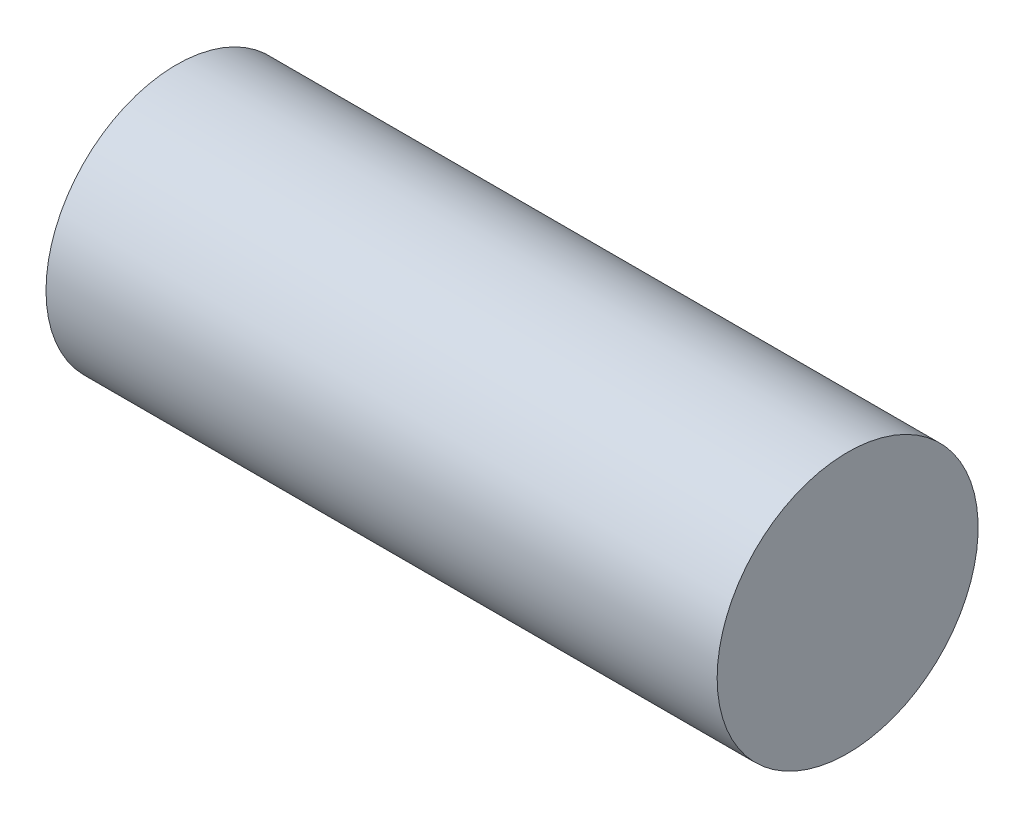
ISO-10303-21;
HEADER;
FILE_DESCRIPTION(('STEP AP214'),'2;1');
FILE_NAME('part.step','',(''),(''),'','','');
FILE_SCHEMA(('AUTOMOTIVE_DESIGN { 1 0 10303 214 1 1 1 1 }'));
ENDSEC;
DATA;
#1=APPLICATION_CONTEXT('core data for automotive mechanical design processes');
#2=APPLICATION_PROTOCOL_DEFINITION('international standard','automotive_design',2000,#1);
#3=PRODUCT_CONTEXT('',#1,'mechanical');
#4=PRODUCT('Part','Part','',(#3));
#5=PRODUCT_RELATED_PRODUCT_CATEGORY('part','',(#4));
#6=PRODUCT_DEFINITION_FORMATION('','',#4);
#7=PRODUCT_DEFINITION_CONTEXT('part definition',#1,'design');
#8=PRODUCT_DEFINITION('design','',#6,#7);
#9=PRODUCT_DEFINITION_SHAPE('','',#8);
#10=(LENGTH_UNIT() NAMED_UNIT(*) SI_UNIT(.MILLI.,.METRE.));
#11=(NAMED_UNIT(*) PLANE_ANGLE_UNIT() SI_UNIT($,.RADIAN.));
#12=(NAMED_UNIT(*) SI_UNIT($,.STERADIAN.) SOLID_ANGLE_UNIT());
#13=UNCERTAINTY_MEASURE_WITH_UNIT(LENGTH_MEASURE(1.E-05),#10,'distance_accuracy_value','');
#14=(GEOMETRIC_REPRESENTATION_CONTEXT(3) GLOBAL_UNCERTAINTY_ASSIGNED_CONTEXT((#13)) GLOBAL_UNIT_ASSIGNED_CONTEXT((#10,
#11,#12)) REPRESENTATION_CONTEXT('',''));
#15=CARTESIAN_POINT('',(0.,0.,0.));
#16=DIRECTION('',(0.,0.,1.));
#17=DIRECTION('',(1.,0.,0.));
#18=AXIS2_PLACEMENT_3D('',#15,#16,#17);
#19=CARTESIAN_POINT('',(90.,0.,0.));
#20=DIRECTION('',(-1.,0.,0.));
#21=DIRECTION('',(0.,0.,1.));
#22=AXIS2_PLACEMENT_3D('',#19,#20,#21);
#23=CYLINDRICAL_SURFACE('',#22,35.);
#24=CARTESIAN_POINT('',(90.,0.,0.));
#25=DIRECTION('',(1.,0.,0.));
#26=DIRECTION('',(0.,0.,-1.));
#27=AXIS2_PLACEMENT_3D('',#24,#25,#26);
#28=CIRCLE('',#27,35.);
#29=CARTESIAN_POINT('',(90.,0.,35.));
#30=VERTEX_POINT('',#29);
#31=EDGE_CURVE('E10',#30,#30,#28,.T.);
#32=CARTESIAN_POINT('',(-90.,0.,0.));
#33=DIRECTION('',(1.,0.,0.));
#34=DIRECTION('',(0.,0.,-1.));
#35=AXIS2_PLACEMENT_3D('',#32,#33,#34);
#36=CIRCLE('',#35,35.);
#37=CARTESIAN_POINT('',(-90.,0.,35.));
#38=VERTEX_POINT('',#37);
#39=EDGE_CURVE('E45',#38,#38,#36,.T.);
#40=CARTESIAN_POINT('',(90.,0.,35.));
#41=CARTESIAN_POINT('',(88.125,0.,35.));
#42=CARTESIAN_POINT('',(86.25,0.,35.));
#43=CARTESIAN_POINT('',(82.5,0.,35.));
#44=CARTESIAN_POINT('',(80.625,0.,35.));
#45=CARTESIAN_POINT('',(76.875,0.,35.));
#46=CARTESIAN_POINT('',(75.,0.,35.));
#47=CARTESIAN_POINT('',(71.25,0.,35.));
#48=CARTESIAN_POINT('',(69.375,0.,35.));
#49=CARTESIAN_POINT('',(65.625,0.,35.));
#50=CARTESIAN_POINT('',(63.75,0.,35.));
#51=CARTESIAN_POINT('',(60.,0.,35.));
#52=CARTESIAN_POINT('',(58.125,0.,35.));
#53=CARTESIAN_POINT('',(54.375,0.,35.));
#54=CARTESIAN_POINT('',(52.5,0.,35.));
#55=CARTESIAN_POINT('',(48.75,0.,35.));
#56=CARTESIAN_POINT('',(46.875,0.,35.));
#57=CARTESIAN_POINT('',(43.125,0.,35.));
#58=CARTESIAN_POINT('',(41.25,0.,35.));
#59=CARTESIAN_POINT('',(37.5,0.,35.));
#60=CARTESIAN_POINT('',(35.625,0.,35.));
#61=CARTESIAN_POINT('',(31.875,0.,35.));
#62=CARTESIAN_POINT('',(30.,0.,35.));
#63=CARTESIAN_POINT('',(26.25,0.,35.));
#64=CARTESIAN_POINT('',(24.375,0.,35.));
#65=CARTESIAN_POINT('',(20.625,0.,35.));
#66=CARTESIAN_POINT('',(18.75,0.,35.));
#67=CARTESIAN_POINT('',(15.,0.,35.));
#68=CARTESIAN_POINT('',(13.125,0.,35.));
#69=CARTESIAN_POINT('',(9.37499999999999,0.,35.));
#70=CARTESIAN_POINT('',(7.49999999999999,0.,35.));
#71=CARTESIAN_POINT('',(3.74999999999999,0.,35.));
#72=CARTESIAN_POINT('',(1.87499999999999,0.,35.));
#73=CARTESIAN_POINT('',(-1.87500000000002,0.,35.));
#74=CARTESIAN_POINT('',(-3.75000000000002,0.,35.));
#75=CARTESIAN_POINT('',(-7.50000000000002,0.,35.));
#76=CARTESIAN_POINT('',(-9.37500000000002,0.,35.));
#77=CARTESIAN_POINT('',(-13.125,0.,35.));
#78=CARTESIAN_POINT('',(-15.,0.,35.));
#79=CARTESIAN_POINT('',(-18.75,0.,35.));
#80=CARTESIAN_POINT('',(-20.625,0.,35.));
#81=CARTESIAN_POINT('',(-24.375,0.,35.));
#82=CARTESIAN_POINT('',(-26.25,0.,35.));
#83=CARTESIAN_POINT('',(-30.,0.,35.));
#84=CARTESIAN_POINT('',(-31.875,0.,35.));
#85=CARTESIAN_POINT('',(-35.625,0.,35.));
#86=CARTESIAN_POINT('',(-37.5,0.,35.));
#87=CARTESIAN_POINT('',(-41.25,0.,35.));
#88=CARTESIAN_POINT('',(-43.125,0.,35.));
#89=CARTESIAN_POINT('',(-46.875,0.,35.));
#90=CARTESIAN_POINT('',(-48.75,0.,35.));
#91=CARTESIAN_POINT('',(-52.5,0.,35.));
#92=CARTESIAN_POINT('',(-54.375,0.,35.));
#93=CARTESIAN_POINT('',(-58.125,0.,35.));
#94=CARTESIAN_POINT('',(-60.,0.,35.));
#95=CARTESIAN_POINT('',(-63.75,0.,35.));
#96=CARTESIAN_POINT('',(-65.625,0.,35.));
#97=CARTESIAN_POINT('',(-69.375,0.,35.));
#98=CARTESIAN_POINT('',(-71.25,0.,35.));
#99=CARTESIAN_POINT('',(-75.,0.,35.));
#100=CARTESIAN_POINT('',(-76.875,0.,35.));
#101=CARTESIAN_POINT('',(-80.625,0.,35.));
#102=CARTESIAN_POINT('',(-82.5,0.,35.));
#103=CARTESIAN_POINT('',(-86.25,0.,35.));
#104=CARTESIAN_POINT('',(-88.125,0.,35.));
#105=CARTESIAN_POINT('',(-90.,0.,35.));
#106=B_SPLINE_CURVE_WITH_KNOTS('',3,(#40,#41,#42,#43,#44,#45,#46,#47,#48,#49,#50,#51,#52,#53,
#54,#55,#56,#57,#58,#59,#60,#61,#62,#63,#64,#65,#66,#67,#68,#69,#70,#71,#72,#73,#74,#75,#76,#77,
#78,#79,#80,#81,#82,#83,#84,#85,#86,#87,#88,#89,#90,#91,#92,#93,#94,#95,#96,#97,#98,#99,#100,
#101,#102,#103,#104,#105),.UNSPECIFIED.,.F.,.F.,(4,2,2,2,2,2,2,2,2,2,2,2,2,2,2,2,2,2,2,2,2,2,2,
2,2,2,2,2,2,2,2,2,4),(0.,5.62500000000001,11.25,16.875,22.5,28.125,33.75,39.375,45.,50.625,
56.25,61.875,67.5,73.125,78.75,84.375,90.,95.625,101.25,106.875,112.5,118.125,123.75,129.375,
135.,140.625,146.25,151.875,157.5,163.125,168.75,174.375,180.),.UNSPECIFIED.);
#107=EDGE_CURVE('BSEAM42',#30,#38,#106,.T.);
#108=ORIENTED_EDGE('',*,*,#31,.F.);
#109=ORIENTED_EDGE('',*,*,#39,.T.);
#110=ORIENTED_EDGE('',*,*,#107,.T.);
#111=ORIENTED_EDGE('',*,*,#107,.F.);
#112=EDGE_LOOP('',(#108,#110,#109,#111));
#113=FACE_BOUND('',#112,.T.);
#114=ADVANCED_FACE('F42',(#113),#23,.T.);
#115=CARTESIAN_POINT('',(90.,0.,0.));
#116=DIRECTION('',(1.,0.,0.));
#117=DIRECTION('',(0.,0.,-1.));
#118=AXIS2_PLACEMENT_3D('',#115,#116,#117);
#119=PLANE('',#118);
#120=ORIENTED_EDGE('',*,*,#31,.T.);
#121=EDGE_LOOP('',(#120));
#122=FACE_BOUND('',#121,.T.);
#123=ADVANCED_FACE('F57',(#122),#119,.T.);
#124=CARTESIAN_POINT('',(-90.,0.,0.));
#125=DIRECTION('',(1.,0.,0.));
#126=DIRECTION('',(0.,0.,-1.));
#127=AXIS2_PLACEMENT_3D('',#124,#125,#126);
#128=PLANE('',#127);
#129=ORIENTED_EDGE('',*,*,#39,.F.);
#130=EDGE_LOOP('',(#129));
#131=FACE_BOUND('',#130,.T.);
#132=ADVANCED_FACE('F55',(#131),#128,.F.);
#133=CLOSED_SHELL('',(#114,#123,#132));
#134=MANIFOLD_SOLID_BREP('B2',#133);
#135=ADVANCED_BREP_SHAPE_REPRESENTATION('',(#18,#134),#14);
#136=SHAPE_DEFINITION_REPRESENTATION(#9,#135);
ENDSEC;
END-ISO-10303-21;
